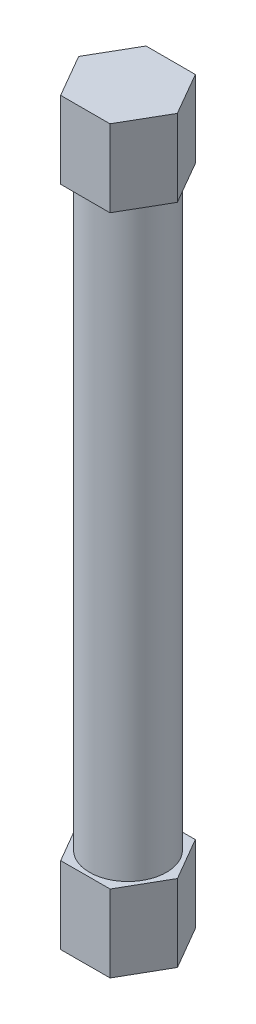
ISO-10303-21;
HEADER;
FILE_DESCRIPTION(('STEP AP214'),'2;1');
FILE_NAME('part.step','',(''),(''),'','','');
FILE_SCHEMA(('AUTOMOTIVE_DESIGN { 1 0 10303 214 1 1 1 1 }'));
ENDSEC;
DATA;
#1=APPLICATION_CONTEXT('core data for automotive mechanical design processes');
#2=APPLICATION_PROTOCOL_DEFINITION('international standard','automotive_design',2000,#1);
#3=PRODUCT_CONTEXT('',#1,'mechanical');
#4=PRODUCT('Part','Part','',(#3));
#5=PRODUCT_RELATED_PRODUCT_CATEGORY('part','',(#4));
#6=PRODUCT_DEFINITION_FORMATION('','',#4);
#7=PRODUCT_DEFINITION_CONTEXT('part definition',#1,'design');
#8=PRODUCT_DEFINITION('design','',#6,#7);
#9=PRODUCT_DEFINITION_SHAPE('','',#8);
#10=(LENGTH_UNIT() NAMED_UNIT(*) SI_UNIT(.MILLI.,.METRE.));
#11=(NAMED_UNIT(*) PLANE_ANGLE_UNIT() SI_UNIT($,.RADIAN.));
#12=(NAMED_UNIT(*) SI_UNIT($,.STERADIAN.) SOLID_ANGLE_UNIT());
#13=UNCERTAINTY_MEASURE_WITH_UNIT(LENGTH_MEASURE(1.E-05),#10,'distance_accuracy_value','');
#14=(GEOMETRIC_REPRESENTATION_CONTEXT(3) GLOBAL_UNCERTAINTY_ASSIGNED_CONTEXT((#13)) GLOBAL_UNIT_ASSIGNED_CONTEXT((#10,
#11,#12)) REPRESENTATION_CONTEXT('',''));
#15=CARTESIAN_POINT('',(0.,0.,0.));
#16=DIRECTION('',(0.,0.,1.));
#17=DIRECTION('',(1.,0.,0.));
#18=AXIS2_PLACEMENT_3D('',#15,#16,#17);
#19=CARTESIAN_POINT('',(0.,38.,0.));
#20=DIRECTION('',(0.,-1.,0.));
#21=DIRECTION('',(0.,0.,-1.));
#22=AXIS2_PLACEMENT_3D('',#19,#20,#21);
#23=CYLINDRICAL_SURFACE('',#22,2.5);
#24=CARTESIAN_POINT('',(0.,38.,0.));
#25=DIRECTION('',(0.,1.,0.));
#26=DIRECTION('',(0.,0.,1.));
#27=AXIS2_PLACEMENT_3D('',#24,#25,#26);
#28=CIRCLE('',#27,2.5);
#29=CARTESIAN_POINT('',(0.,38.,2.5));
#30=VERTEX_POINT('',#29);
#31=EDGE_CURVE('E11',#30,#30,#28,.T.);
#32=ORIENTED_EDGE('',*,*,#31,.F.);
#33=EDGE_LOOP('',(#32));
#34=FACE_BOUND('',#33,.T.);
#35=CARTESIAN_POINT('',(0.,0.,0.));
#36=DIRECTION('',(0.,1.,0.));
#37=DIRECTION('',(0.,0.,1.));
#38=AXIS2_PLACEMENT_3D('',#35,#36,#37);
#39=CIRCLE('',#38,2.5);
#40=CARTESIAN_POINT('',(0.,0.,2.5));
#41=VERTEX_POINT('',#40);
#42=EDGE_CURVE('E43',#41,#41,#39,.T.);
#43=ORIENTED_EDGE('',*,*,#42,.T.);
#44=EDGE_LOOP('',(#43));
#45=FACE_BOUND('',#44,.T.);
#46=ADVANCED_FACE('F40',(#34,#45),#23,.T.);
#47=CARTESIAN_POINT('',(1.6,43.,2.7712812921102));
#48=DIRECTION('',(-0.866025403784439,0.,-0.5));
#49=DIRECTION('',(-0.5,0.,0.866025403784439));
#50=AXIS2_PLACEMENT_3D('',#47,#48,#49);
#51=PLANE('',#50);
#52=DIRECTION('',(0.5,0.,-0.866025403784439));
#53=VECTOR('',#52,1.);
#54=CARTESIAN_POINT('',(1.6,38.,2.7712812921102));
#55=LINE('',#54,#53);
#56=CARTESIAN_POINT('',(1.6,38.,2.7712812921102));
#57=VERTEX_POINT('',#56);
#58=CARTESIAN_POINT('',(3.2,38.,0.));
#59=VERTEX_POINT('',#58);
#60=EDGE_CURVE('E130',#57,#59,#55,.T.);
#61=ORIENTED_EDGE('',*,*,#60,.T.);
#62=DIRECTION('',(0.,-1.,0.));
#63=VECTOR('',#62,1.);
#64=CARTESIAN_POINT('',(3.2,43.,0.));
#65=LINE('',#64,#63);
#66=CARTESIAN_POINT('',(3.2,43.,0.));
#67=VERTEX_POINT('',#66);
#68=EDGE_CURVE('E49',#67,#59,#65,.T.);
#69=ORIENTED_EDGE('',*,*,#68,.F.);
#70=DIRECTION('',(0.5,0.,-0.866025403784439));
#71=VECTOR('',#70,1.);
#72=CARTESIAN_POINT('',(1.6,43.,2.7712812921102));
#73=LINE('',#72,#71);
#74=CARTESIAN_POINT('',(1.6,43.,2.7712812921102));
#75=VERTEX_POINT('',#74);
#76=EDGE_CURVE('E140',#75,#67,#73,.T.);
#77=ORIENTED_EDGE('',*,*,#76,.F.);
#78=DIRECTION('',(0.,-1.,0.));
#79=VECTOR('',#78,1.);
#80=CARTESIAN_POINT('',(1.6,43.,2.7712812921102));
#81=LINE('',#80,#79);
#82=EDGE_CURVE('E126',#75,#57,#81,.T.);
#83=ORIENTED_EDGE('',*,*,#82,.T.);
#84=EDGE_LOOP('',(#61,#69,#77,#83));
#85=FACE_BOUND('',#84,.T.);
#86=ADVANCED_FACE('F152',(#85),#51,.F.);
#87=CARTESIAN_POINT('',(3.2,43.,0.));
#88=DIRECTION('',(-0.866025403784439,0.,0.5));
#89=DIRECTION('',(0.5,0.,0.866025403784439));
#90=AXIS2_PLACEMENT_3D('',#87,#88,#89);
#91=PLANE('',#90);
#92=DIRECTION('',(-0.5,0.,-0.866025403784439));
#93=VECTOR('',#92,1.);
#94=CARTESIAN_POINT('',(3.2,38.,0.));
#95=LINE('',#94,#93);
#96=CARTESIAN_POINT('',(1.6,38.,-2.7712812921102));
#97=VERTEX_POINT('',#96);
#98=EDGE_CURVE('E133',#59,#97,#95,.T.);
#99=ORIENTED_EDGE('',*,*,#98,.T.);
#100=DIRECTION('',(0.,-1.,0.));
#101=VECTOR('',#100,1.);
#102=CARTESIAN_POINT('',(1.6,43.,-2.7712812921102));
#103=LINE('',#102,#101);
#104=CARTESIAN_POINT('',(1.6,43.,-2.7712812921102));
#105=VERTEX_POINT('',#104);
#106=EDGE_CURVE('E144',#105,#97,#103,.T.);
#107=ORIENTED_EDGE('',*,*,#106,.F.);
#108=DIRECTION('',(-0.5,0.,-0.866025403784439));
#109=VECTOR('',#108,1.);
#110=CARTESIAN_POINT('',(3.2,43.,0.));
#111=LINE('',#110,#109);
#112=EDGE_CURVE('E96',#67,#105,#111,.T.);
#113=ORIENTED_EDGE('',*,*,#112,.F.);
#114=ORIENTED_EDGE('',*,*,#68,.T.);
#115=EDGE_LOOP('',(#99,#107,#113,#114));
#116=FACE_BOUND('',#115,.T.);
#117=ADVANCED_FACE('F148',(#116),#91,.F.);
#118=CARTESIAN_POINT('',(1.6,43.,-2.7712812921102));
#119=DIRECTION('',(0.,0.,1.));
#120=DIRECTION('',(1.,0.,0.));
#121=AXIS2_PLACEMENT_3D('',#118,#119,#120);
#122=PLANE('',#121);
#123=DIRECTION('',(-1.,0.,0.));
#124=VECTOR('',#123,1.);
#125=CARTESIAN_POINT('',(1.6,38.,-2.7712812921102));
#126=LINE('',#125,#124);
#127=CARTESIAN_POINT('',(-1.6,38.,-2.7712812921102));
#128=VERTEX_POINT('',#127);
#129=EDGE_CURVE('E135',#97,#128,#126,.T.);
#130=ORIENTED_EDGE('',*,*,#129,.T.);
#131=DIRECTION('',(0.,-1.,0.));
#132=VECTOR('',#131,1.);
#133=CARTESIAN_POINT('',(-1.6,43.,-2.7712812921102));
#134=LINE('',#133,#132);
#135=CARTESIAN_POINT('',(-1.6,43.,-2.7712812921102));
#136=VERTEX_POINT('',#135);
#137=EDGE_CURVE('E121',#136,#128,#134,.T.);
#138=ORIENTED_EDGE('',*,*,#137,.F.);
#139=DIRECTION('',(-1.,0.,0.));
#140=VECTOR('',#139,1.);
#141=CARTESIAN_POINT('',(1.6,43.,-2.7712812921102));
#142=LINE('',#141,#140);
#143=EDGE_CURVE('E112',#105,#136,#142,.T.);
#144=ORIENTED_EDGE('',*,*,#143,.F.);
#145=ORIENTED_EDGE('',*,*,#106,.T.);
#146=EDGE_LOOP('',(#130,#138,#144,#145));
#147=FACE_BOUND('',#146,.T.);
#148=ADVANCED_FACE('F157',(#147),#122,.F.);
#149=CARTESIAN_POINT('',(-1.6,43.,-2.7712812921102));
#150=DIRECTION('',(0.866025403784439,0.,0.5));
#151=DIRECTION('',(0.5,0.,-0.866025403784439));
#152=AXIS2_PLACEMENT_3D('',#149,#150,#151);
#153=PLANE('',#152);
#154=DIRECTION('',(-0.5,0.,0.866025403784438));
#155=VECTOR('',#154,1.);
#156=CARTESIAN_POINT('',(-1.6,38.,-2.7712812921102));
#157=LINE('',#156,#155);
#158=CARTESIAN_POINT('',(-3.2,38.,0.));
#159=VERTEX_POINT('',#158);
#160=EDGE_CURVE('E120',#128,#159,#157,.T.);
#161=ORIENTED_EDGE('',*,*,#160,.T.);
#162=DIRECTION('',(0.,-1.,0.));
#163=VECTOR('',#162,1.);
#164=CARTESIAN_POINT('',(-3.2,43.,0.));
#165=LINE('',#164,#163);
#166=CARTESIAN_POINT('',(-3.2,43.,0.));
#167=VERTEX_POINT('',#166);
#168=EDGE_CURVE('E117',#167,#159,#165,.T.);
#169=ORIENTED_EDGE('',*,*,#168,.F.);
#170=DIRECTION('',(-0.5,0.,0.866025403784438));
#171=VECTOR('',#170,1.);
#172=CARTESIAN_POINT('',(-1.6,43.,-2.7712812921102));
#173=LINE('',#172,#171);
#174=EDGE_CURVE('E106',#136,#167,#173,.T.);
#175=ORIENTED_EDGE('',*,*,#174,.F.);
#176=ORIENTED_EDGE('',*,*,#137,.T.);
#177=EDGE_LOOP('',(#161,#169,#175,#176));
#178=FACE_BOUND('',#177,.T.);
#179=ADVANCED_FACE('F118',(#178),#153,.F.);
#180=CARTESIAN_POINT('',(-3.2,43.,0.));
#181=DIRECTION('',(0.866025403784439,0.,-0.5));
#182=DIRECTION('',(-0.5,0.,-0.866025403784439));
#183=AXIS2_PLACEMENT_3D('',#180,#181,#182);
#184=PLANE('',#183);
#185=DIRECTION('',(0.5,0.,0.866025403784439));
#186=VECTOR('',#185,1.);
#187=CARTESIAN_POINT('',(-3.2,38.,0.));
#188=LINE('',#187,#186);
#189=CARTESIAN_POINT('',(-1.6,38.,2.7712812921102));
#190=VERTEX_POINT('',#189);
#191=EDGE_CURVE('E81',#159,#190,#188,.T.);
#192=ORIENTED_EDGE('',*,*,#191,.T.);
#193=DIRECTION('',(0.,-1.,0.));
#194=VECTOR('',#193,1.);
#195=CARTESIAN_POINT('',(-1.6,43.,2.7712812921102));
#196=LINE('',#195,#194);
#197=CARTESIAN_POINT('',(-1.6,43.,2.7712812921102));
#198=VERTEX_POINT('',#197);
#199=EDGE_CURVE('E122',#198,#190,#196,.T.);
#200=ORIENTED_EDGE('',*,*,#199,.F.);
#201=DIRECTION('',(0.5,0.,0.866025403784439));
#202=VECTOR('',#201,1.);
#203=CARTESIAN_POINT('',(-3.2,43.,0.));
#204=LINE('',#203,#202);
#205=EDGE_CURVE('E110',#167,#198,#204,.T.);
#206=ORIENTED_EDGE('',*,*,#205,.F.);
#207=ORIENTED_EDGE('',*,*,#168,.T.);
#208=EDGE_LOOP('',(#192,#200,#206,#207));
#209=FACE_BOUND('',#208,.T.);
#210=ADVANCED_FACE('F124',(#209),#184,.F.);
#211=CARTESIAN_POINT('',(-1.6,43.,2.7712812921102));
#212=DIRECTION('',(0.,0.,-1.));
#213=DIRECTION('',(-1.,0.,0.));
#214=AXIS2_PLACEMENT_3D('',#211,#212,#213);
#215=PLANE('',#214);
#216=DIRECTION('',(1.,0.,0.));
#217=VECTOR('',#216,1.);
#218=CARTESIAN_POINT('',(-1.6,38.,2.7712812921102));
#219=LINE('',#218,#217);
#220=EDGE_CURVE('E87',#190,#57,#219,.T.);
#221=ORIENTED_EDGE('',*,*,#220,.T.);
#222=ORIENTED_EDGE('',*,*,#82,.F.);
#223=DIRECTION('',(1.,0.,0.));
#224=VECTOR('',#223,1.);
#225=CARTESIAN_POINT('',(-1.6,43.,2.7712812921102));
#226=LINE('',#225,#224);
#227=EDGE_CURVE('E57',#198,#75,#226,.T.);
#228=ORIENTED_EDGE('',*,*,#227,.F.);
#229=ORIENTED_EDGE('',*,*,#199,.T.);
#230=EDGE_LOOP('',(#221,#222,#228,#229));
#231=FACE_BOUND('',#230,.T.);
#232=ADVANCED_FACE('F276',(#231),#215,.F.);
#233=CARTESIAN_POINT('',(0.,43.,0.));
#234=DIRECTION('',(0.,1.,0.));
#235=DIRECTION('',(0.,0.,1.));
#236=AXIS2_PLACEMENT_3D('',#233,#234,#235);
#237=PLANE('',#236);
#238=ORIENTED_EDGE('',*,*,#76,.T.);
#239=ORIENTED_EDGE('',*,*,#112,.T.);
#240=ORIENTED_EDGE('',*,*,#143,.T.);
#241=ORIENTED_EDGE('',*,*,#174,.T.);
#242=ORIENTED_EDGE('',*,*,#205,.T.);
#243=ORIENTED_EDGE('',*,*,#227,.T.);
#244=EDGE_LOOP('',(#238,#239,#240,#241,#242,#243));
#245=FACE_BOUND('',#244,.T.);
#246=ADVANCED_FACE('F108',(#245),#237,.T.);
#247=CARTESIAN_POINT('',(0.,38.,0.));
#248=DIRECTION('',(0.,1.,0.));
#249=DIRECTION('',(0.,0.,1.));
#250=AXIS2_PLACEMENT_3D('',#247,#248,#249);
#251=PLANE('',#250);
#252=ORIENTED_EDGE('',*,*,#31,.T.);
#253=EDGE_LOOP('',(#252));
#254=FACE_BOUND('',#253,.T.);
#255=ORIENTED_EDGE('',*,*,#60,.F.);
#256=ORIENTED_EDGE('',*,*,#220,.F.);
#257=ORIENTED_EDGE('',*,*,#191,.F.);
#258=ORIENTED_EDGE('',*,*,#160,.F.);
#259=ORIENTED_EDGE('',*,*,#129,.F.);
#260=ORIENTED_EDGE('',*,*,#98,.F.);
#261=EDGE_LOOP('',(#255,#256,#257,#258,#259,#260));
#262=FACE_BOUND('',#261,.T.);
#263=ADVANCED_FACE('F154',(#254,#262),#251,.F.);
#264=CARTESIAN_POINT('',(1.59161674902497,-5.,-2.77610448726686));
#265=DIRECTION('',(-0.864510244180579,0.,0.502615198443935));
#266=DIRECTION('',(0.502615198443935,0.,0.864510244180579));
#267=AXIS2_PLACEMENT_3D('',#264,#265,#266);
#268=PLANE('',#267);
#269=DIRECTION('',(0.502615198443935,0.,0.864510244180579));
#270=VECTOR('',#269,1.);
#271=CARTESIAN_POINT('',(1.59161674902497,0.,-2.77610448726686));
#272=LINE('',#271,#270);
#273=CARTESIAN_POINT('',(1.59161674902497,0.,-2.77610448726686));
#274=VERTEX_POINT('',#273);
#275=CARTESIAN_POINT('',(3.19998538404556,0.,-0.00967170588900713));
#276=VERTEX_POINT('',#275);
#277=EDGE_CURVE('E196',#274,#276,#272,.T.);
#278=ORIENTED_EDGE('',*,*,#277,.T.);
#279=DIRECTION('',(0.,1.,0.));
#280=VECTOR('',#279,1.);
#281=CARTESIAN_POINT('',(3.19998538404556,-5.,-0.00967170588900713));
#282=LINE('',#281,#280);
#283=CARTESIAN_POINT('',(3.19998538404556,-5.,-0.00967170588900713));
#284=VERTEX_POINT('',#283);
#285=EDGE_CURVE('E161',#284,#276,#282,.T.);
#286=ORIENTED_EDGE('',*,*,#285,.F.);
#287=DIRECTION('',(0.502615198443935,0.,0.864510244180579));
#288=VECTOR('',#287,1.);
#289=CARTESIAN_POINT('',(1.59161674902497,-5.,-2.77610448726686));
#290=LINE('',#289,#288);
#291=CARTESIAN_POINT('',(1.59161674902497,-5.,-2.77610448726686));
#292=VERTEX_POINT('',#291);
#293=EDGE_CURVE('E183',#292,#284,#290,.T.);
#294=ORIENTED_EDGE('',*,*,#293,.F.);
#295=DIRECTION('',(0.,1.,0.));
#296=VECTOR('',#295,1.);
#297=CARTESIAN_POINT('',(1.59161674902497,-5.,-2.77610448726686));
#298=LINE('',#297,#296);
#299=EDGE_CURVE('E176',#292,#274,#298,.T.);
#300=ORIENTED_EDGE('',*,*,#299,.T.);
#301=EDGE_LOOP('',(#278,#286,#294,#300));
#302=FACE_BOUND('',#301,.T.);
#303=ADVANCED_FACE('F226',(#302),#268,.F.);
#304=CARTESIAN_POINT('',(3.19998538404556,-5.,-0.00967170588900713));
#305=DIRECTION('',(-0.867532652270894,0.,-0.497380234070302));
#306=DIRECTION('',(-0.497380234070302,0.,0.867532652270894));
#307=AXIS2_PLACEMENT_3D('',#304,#305,#306);
#308=PLANE('',#307);
#309=DIRECTION('',(-0.497380234070302,0.,0.867532652270894));
#310=VECTOR('',#309,1.);
#311=CARTESIAN_POINT('',(3.19998538404556,0.,-0.00967170588900713));
#312=LINE('',#311,#310);
#313=CARTESIAN_POINT('',(1.60836863502059,0.,2.76643278137785));
#314=VERTEX_POINT('',#313);
#315=EDGE_CURVE('E193',#276,#314,#312,.T.);
#316=ORIENTED_EDGE('',*,*,#315,.T.);
#317=DIRECTION('',(0.,1.,0.));
#318=VECTOR('',#317,1.);
#319=CARTESIAN_POINT('',(1.60836863502059,-5.,2.76643278137785));
#320=LINE('',#319,#318);
#321=CARTESIAN_POINT('',(1.60836863502059,-5.,2.76643278137785));
#322=VERTEX_POINT('',#321);
#323=EDGE_CURVE('E164',#322,#314,#320,.T.);
#324=ORIENTED_EDGE('',*,*,#323,.F.);
#325=DIRECTION('',(-0.497380234070302,0.,0.867532652270894));
#326=VECTOR('',#325,1.);
#327=CARTESIAN_POINT('',(3.19998538404556,-5.,-0.00967170588900713));
#328=LINE('',#327,#326);
#329=EDGE_CURVE('E210',#284,#322,#328,.T.);
#330=ORIENTED_EDGE('',*,*,#329,.F.);
#331=ORIENTED_EDGE('',*,*,#285,.T.);
#332=EDGE_LOOP('',(#316,#324,#330,#331));
#333=FACE_BOUND('',#332,.T.);
#334=ADVANCED_FACE('F230',(#333),#308,.F.);
#335=CARTESIAN_POINT('',(1.60836863502059,-5.,2.76643278137785));
#336=DIRECTION('',(-0.00302240809031527,0.,-0.999995432514237));
#337=DIRECTION('',(-0.999995432514237,0.,0.00302240809031527));
#338=AXIS2_PLACEMENT_3D('',#335,#336,#337);
#339=PLANE('',#338);
#340=DIRECTION('',(-0.999995432514237,0.,0.00302240809031527));
#341=VECTOR('',#340,1.);
#342=CARTESIAN_POINT('',(1.60836863502059,0.,2.76643278137785));
#343=LINE('',#342,#341);
#344=CARTESIAN_POINT('',(-1.59161674902497,0.,2.77610448726686));
#345=VERTEX_POINT('',#344);
#346=EDGE_CURVE('E190',#314,#345,#343,.T.);
#347=ORIENTED_EDGE('',*,*,#346,.T.);
#348=DIRECTION('',(0.,1.,0.));
#349=VECTOR('',#348,1.);
#350=CARTESIAN_POINT('',(-1.59161674902497,-5.,2.77610448726686));
#351=LINE('',#350,#349);
#352=CARTESIAN_POINT('',(-1.59161674902497,-5.,2.77610448726686));
#353=VERTEX_POINT('',#352);
#354=EDGE_CURVE('E167',#353,#345,#351,.T.);
#355=ORIENTED_EDGE('',*,*,#354,.F.);
#356=DIRECTION('',(-0.999995432514237,0.,0.00302240809031527));
#357=VECTOR('',#356,1.);
#358=CARTESIAN_POINT('',(1.60836863502059,-5.,2.76643278137785));
#359=LINE('',#358,#357);
#360=EDGE_CURVE('E207',#322,#353,#359,.T.);
#361=ORIENTED_EDGE('',*,*,#360,.F.);
#362=ORIENTED_EDGE('',*,*,#323,.T.);
#363=EDGE_LOOP('',(#347,#355,#361,#362));
#364=FACE_BOUND('',#363,.T.);
#365=ADVANCED_FACE('F334',(#364),#339,.F.);
#366=CARTESIAN_POINT('',(-1.59161674902497,-5.,2.77610448726686));
#367=DIRECTION('',(0.864510244180579,0.,-0.502615198443935));
#368=DIRECTION('',(-0.502615198443935,0.,-0.864510244180579));
#369=AXIS2_PLACEMENT_3D('',#366,#367,#368);
#370=PLANE('',#369);
#371=DIRECTION('',(-0.502615198443935,0.,-0.864510244180579));
#372=VECTOR('',#371,1.);
#373=CARTESIAN_POINT('',(-1.59161674902497,0.,2.77610448726686));
#374=LINE('',#373,#372);
#375=CARTESIAN_POINT('',(-3.19998538404556,0.,0.00967170588900756));
#376=VERTEX_POINT('',#375);
#377=EDGE_CURVE('E187',#345,#376,#374,.T.);
#378=ORIENTED_EDGE('',*,*,#377,.T.);
#379=DIRECTION('',(0.,1.,0.));
#380=VECTOR('',#379,1.);
#381=CARTESIAN_POINT('',(-3.19998538404556,-5.,0.00967170588900756));
#382=LINE('',#381,#380);
#383=CARTESIAN_POINT('',(-3.19998538404556,-5.,0.00967170588900756));
#384=VERTEX_POINT('',#383);
#385=EDGE_CURVE('E170',#384,#376,#382,.T.);
#386=ORIENTED_EDGE('',*,*,#385,.F.);
#387=DIRECTION('',(-0.502615198443935,0.,-0.864510244180579));
#388=VECTOR('',#387,1.);
#389=CARTESIAN_POINT('',(-1.59161674902497,-5.,2.77610448726686));
#390=LINE('',#389,#388);
#391=EDGE_CURVE('E204',#353,#384,#390,.T.);
#392=ORIENTED_EDGE('',*,*,#391,.F.);
#393=ORIENTED_EDGE('',*,*,#354,.T.);
#394=EDGE_LOOP('',(#378,#386,#392,#393));
#395=FACE_BOUND('',#394,.T.);
#396=ADVANCED_FACE('F344',(#395),#370,.F.);
#397=CARTESIAN_POINT('',(-3.19998538404556,-5.,0.00967170588900756));
#398=DIRECTION('',(0.867532652270894,0.,0.497380234070302));
#399=DIRECTION('',(0.497380234070302,0.,-0.867532652270894));
#400=AXIS2_PLACEMENT_3D('',#397,#398,#399);
#401=PLANE('',#400);
#402=DIRECTION('',(0.497380234070302,0.,-0.867532652270894));
#403=VECTOR('',#402,1.);
#404=CARTESIAN_POINT('',(-3.19998538404556,0.,0.00967170588900756));
#405=LINE('',#404,#403);
#406=CARTESIAN_POINT('',(-1.60836863502059,0.,-2.76643278137785));
#407=VERTEX_POINT('',#406);
#408=EDGE_CURVE('E184',#376,#407,#405,.T.);
#409=ORIENTED_EDGE('',*,*,#408,.T.);
#410=DIRECTION('',(0.,1.,0.));
#411=VECTOR('',#410,1.);
#412=CARTESIAN_POINT('',(-1.60836863502059,-5.,-2.76643278137785));
#413=LINE('',#412,#411);
#414=CARTESIAN_POINT('',(-1.60836863502059,-5.,-2.76643278137785));
#415=VERTEX_POINT('',#414);
#416=EDGE_CURVE('E173',#415,#407,#413,.T.);
#417=ORIENTED_EDGE('',*,*,#416,.F.);
#418=DIRECTION('',(0.497380234070302,0.,-0.867532652270894));
#419=VECTOR('',#418,1.);
#420=CARTESIAN_POINT('',(-3.19998538404556,-5.,0.00967170588900756));
#421=LINE('',#420,#419);
#422=EDGE_CURVE('E201',#384,#415,#421,.T.);
#423=ORIENTED_EDGE('',*,*,#422,.F.);
#424=ORIENTED_EDGE('',*,*,#385,.T.);
#425=EDGE_LOOP('',(#409,#417,#423,#424));
#426=FACE_BOUND('',#425,.T.);
#427=ADVANCED_FACE('F355',(#426),#401,.F.);
#428=CARTESIAN_POINT('',(-1.60836863502059,-5.,-2.76643278137785));
#429=DIRECTION('',(0.003022408090315,0.,0.999995432514237));
#430=DIRECTION('',(0.999995432514237,0.,-0.003022408090315));
#431=AXIS2_PLACEMENT_3D('',#428,#429,#430);
#432=PLANE('',#431);
#433=DIRECTION('',(0.999995432514237,0.,-0.003022408090315));
#434=VECTOR('',#433,1.);
#435=CARTESIAN_POINT('',(-1.60836863502059,0.,-2.76643278137785));
#436=LINE('',#435,#434);
#437=EDGE_CURVE('E180',#407,#274,#436,.T.);
#438=ORIENTED_EDGE('',*,*,#437,.T.);
#439=ORIENTED_EDGE('',*,*,#299,.F.);
#440=DIRECTION('',(0.999995432514237,0.,-0.003022408090315));
#441=VECTOR('',#440,1.);
#442=CARTESIAN_POINT('',(-1.60836863502059,-5.,-2.76643278137785));
#443=LINE('',#442,#441);
#444=EDGE_CURVE('E179',#415,#292,#443,.T.);
#445=ORIENTED_EDGE('',*,*,#444,.F.);
#446=ORIENTED_EDGE('',*,*,#416,.T.);
#447=EDGE_LOOP('',(#438,#439,#445,#446));
#448=FACE_BOUND('',#447,.T.);
#449=ADVANCED_FACE('F249',(#448),#432,.F.);
#450=CARTESIAN_POINT('',(0.,-5.,0.));
#451=DIRECTION('',(0.,-1.,0.));
#452=DIRECTION('',(0.,0.,-1.));
#453=AXIS2_PLACEMENT_3D('',#450,#451,#452);
#454=PLANE('',#453);
#455=ORIENTED_EDGE('',*,*,#293,.T.);
#456=ORIENTED_EDGE('',*,*,#329,.T.);
#457=ORIENTED_EDGE('',*,*,#360,.T.);
#458=ORIENTED_EDGE('',*,*,#391,.T.);
#459=ORIENTED_EDGE('',*,*,#422,.T.);
#460=ORIENTED_EDGE('',*,*,#444,.T.);
#461=EDGE_LOOP('',(#455,#456,#457,#458,#459,#460));
#462=FACE_BOUND('',#461,.T.);
#463=ADVANCED_FACE('F218',(#462),#454,.T.);
#464=CARTESIAN_POINT('',(0.,0.,0.));
#465=DIRECTION('',(0.,-1.,0.));
#466=DIRECTION('',(0.,0.,-1.));
#467=AXIS2_PLACEMENT_3D('',#464,#465,#466);
#468=PLANE('',#467);
#469=ORIENTED_EDGE('',*,*,#42,.F.);
#470=EDGE_LOOP('',(#469));
#471=FACE_BOUND('',#470,.T.);
#472=ORIENTED_EDGE('',*,*,#277,.F.);
#473=ORIENTED_EDGE('',*,*,#437,.F.);
#474=ORIENTED_EDGE('',*,*,#408,.F.);
#475=ORIENTED_EDGE('',*,*,#377,.F.);
#476=ORIENTED_EDGE('',*,*,#346,.F.);
#477=ORIENTED_EDGE('',*,*,#315,.F.);
#478=EDGE_LOOP('',(#472,#473,#474,#475,#476,#477));
#479=FACE_BOUND('',#478,.T.);
#480=ADVANCED_FACE('F250',(#471,#479),#468,.F.);
#481=CLOSED_SHELL('',(#46,#86,#117,#148,#179,#210,#232,#246,#263,#303,#334,#365,#396,#427,#449,
#463,#480));
#482=MANIFOLD_SOLID_BREP('B2',#481);
#483=ADVANCED_BREP_SHAPE_REPRESENTATION('',(#18,#482),#14);
#484=SHAPE_DEFINITION_REPRESENTATION(#9,#483);
ENDSEC;
END-ISO-10303-21;
